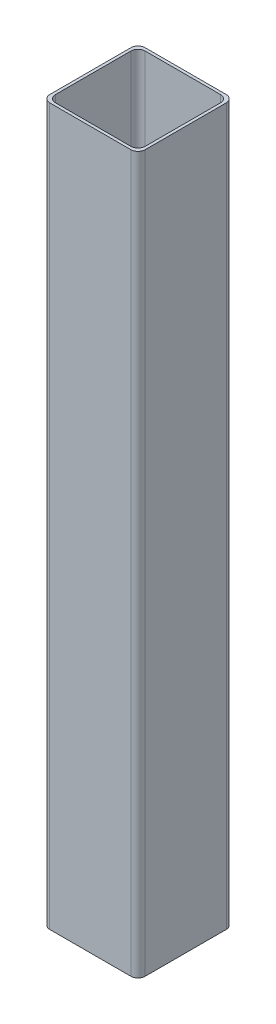
ISO-10303-21;
HEADER;
FILE_DESCRIPTION(('STEP AP214'),'2;1');
FILE_NAME('part.step','',(''),(''),'','','');
FILE_SCHEMA(('AUTOMOTIVE_DESIGN { 1 0 10303 214 1 1 1 1 }'));
ENDSEC;
DATA;
#1=APPLICATION_CONTEXT('core data for automotive mechanical design processes');
#2=APPLICATION_PROTOCOL_DEFINITION('international standard','automotive_design',2000,#1);
#3=PRODUCT_CONTEXT('',#1,'mechanical');
#4=PRODUCT('Part','Part','',(#3));
#5=PRODUCT_RELATED_PRODUCT_CATEGORY('part','',(#4));
#6=PRODUCT_DEFINITION_FORMATION('','',#4);
#7=PRODUCT_DEFINITION_CONTEXT('part definition',#1,'design');
#8=PRODUCT_DEFINITION('design','',#6,#7);
#9=PRODUCT_DEFINITION_SHAPE('','',#8);
#10=(LENGTH_UNIT() NAMED_UNIT(*) SI_UNIT(.MILLI.,.METRE.));
#11=(NAMED_UNIT(*) PLANE_ANGLE_UNIT() SI_UNIT($,.RADIAN.));
#12=(NAMED_UNIT(*) SI_UNIT($,.STERADIAN.) SOLID_ANGLE_UNIT());
#13=UNCERTAINTY_MEASURE_WITH_UNIT(LENGTH_MEASURE(1.E-05),#10,'distance_accuracy_value','');
#14=(GEOMETRIC_REPRESENTATION_CONTEXT(3) GLOBAL_UNCERTAINTY_ASSIGNED_CONTEXT((#13)) GLOBAL_UNIT_ASSIGNED_CONTEXT((#10,
#11,#12)) REPRESENTATION_CONTEXT('',''));
#15=CARTESIAN_POINT('',(0.,0.,0.));
#16=DIRECTION('',(0.,0.,1.));
#17=DIRECTION('',(1.,0.,0.));
#18=AXIS2_PLACEMENT_3D('',#15,#16,#17);
#19=CARTESIAN_POINT('',(0.,150.,0.));
#20=DIRECTION('',(0.,1.,0.));
#21=DIRECTION('',(0.,0.,1.));
#22=AXIS2_PLACEMENT_3D('',#19,#20,#21);
#23=PLANE('',#22);
#24=DIRECTION('',(-1.,0.,0.));
#25=VECTOR('',#24,1.);
#26=CARTESIAN_POINT('',(20.,150.,-20.));
#27=LINE('',#26,#25);
#28=CARTESIAN_POINT('',(17.,150.,-20.));
#29=VERTEX_POINT('',#28);
#30=CARTESIAN_POINT('',(-17.,150.,-20.));
#31=VERTEX_POINT('',#30);
#32=EDGE_CURVE('E183',#29,#31,#27,.T.);
#33=ORIENTED_EDGE('',*,*,#32,.T.);
#34=CARTESIAN_POINT('',(-17.,150.,-17.));
#35=DIRECTION('',(0.,1.,0.));
#36=DIRECTION('',(0.,0.,1.));
#37=AXIS2_PLACEMENT_3D('',#34,#35,#36);
#38=CIRCLE('',#37,3.);
#39=CARTESIAN_POINT('',(-20.,150.,-17.));
#40=VERTEX_POINT('',#39);
#41=EDGE_CURVE('E203',#31,#40,#38,.T.);
#42=ORIENTED_EDGE('',*,*,#41,.T.);
#43=DIRECTION('',(0.,0.,1.));
#44=VECTOR('',#43,1.);
#45=CARTESIAN_POINT('',(-20.,150.,20.));
#46=LINE('',#45,#44);
#47=CARTESIAN_POINT('',(-20.,150.,17.));
#48=VERTEX_POINT('',#47);
#49=EDGE_CURVE('E165',#40,#48,#46,.T.);
#50=ORIENTED_EDGE('',*,*,#49,.T.);
#51=CARTESIAN_POINT('',(-17.,150.,17.));
#52=DIRECTION('',(0.,1.,0.));
#53=DIRECTION('',(0.,0.,1.));
#54=AXIS2_PLACEMENT_3D('',#51,#52,#53);
#55=CIRCLE('',#54,3.);
#56=CARTESIAN_POINT('',(-17.,150.,20.));
#57=VERTEX_POINT('',#56);
#58=EDGE_CURVE('E199',#48,#57,#55,.T.);
#59=ORIENTED_EDGE('',*,*,#58,.T.);
#60=DIRECTION('',(1.,0.,0.));
#61=VECTOR('',#60,1.);
#62=CARTESIAN_POINT('',(20.,150.,20.));
#63=LINE('',#62,#61);
#64=CARTESIAN_POINT('',(17.,150.,20.));
#65=VERTEX_POINT('',#64);
#66=EDGE_CURVE('E275',#57,#65,#63,.T.);
#67=ORIENTED_EDGE('',*,*,#66,.T.);
#68=CARTESIAN_POINT('',(17.,150.,17.));
#69=DIRECTION('',(0.,1.,0.));
#70=DIRECTION('',(0.,0.,1.));
#71=AXIS2_PLACEMENT_3D('',#68,#69,#70);
#72=CIRCLE('',#71,3.);
#73=CARTESIAN_POINT('',(20.,150.,17.));
#74=VERTEX_POINT('',#73);
#75=EDGE_CURVE('E197',#65,#74,#72,.T.);
#76=ORIENTED_EDGE('',*,*,#75,.T.);
#77=DIRECTION('',(0.,0.,-1.));
#78=VECTOR('',#77,1.);
#79=CARTESIAN_POINT('',(20.,150.,20.));
#80=LINE('',#79,#78);
#81=CARTESIAN_POINT('',(20.,150.,-17.));
#82=VERTEX_POINT('',#81);
#83=EDGE_CURVE('E277',#74,#82,#80,.T.);
#84=ORIENTED_EDGE('',*,*,#83,.T.);
#85=CARTESIAN_POINT('',(17.,150.,-17.));
#86=DIRECTION('',(0.,1.,0.));
#87=DIRECTION('',(0.,0.,1.));
#88=AXIS2_PLACEMENT_3D('',#85,#86,#87);
#89=CIRCLE('',#88,3.);
#90=EDGE_CURVE('E201',#82,#29,#89,.T.);
#91=ORIENTED_EDGE('',*,*,#90,.T.);
#92=EDGE_LOOP('',(#33,#42,#50,#59,#67,#76,#84,#91));
#93=FACE_BOUND('',#92,.T.);
#94=DIRECTION('',(0.,0.,-1.));
#95=VECTOR('',#94,1.);
#96=CARTESIAN_POINT('',(18.8,150.,18.8));
#97=LINE('',#96,#95);
#98=CARTESIAN_POINT('',(18.8,150.,15.8));
#99=VERTEX_POINT('',#98);
#100=CARTESIAN_POINT('',(18.8,150.,-15.8));
#101=VERTEX_POINT('',#100);
#102=EDGE_CURVE('E261',#99,#101,#97,.T.);
#103=ORIENTED_EDGE('',*,*,#102,.F.);
#104=CARTESIAN_POINT('',(15.8,150.,15.8));
#105=DIRECTION('',(0.,1.,0.));
#106=DIRECTION('',(0.,0.,1.));
#107=AXIS2_PLACEMENT_3D('',#104,#105,#106);
#108=CIRCLE('',#107,3.);
#109=CARTESIAN_POINT('',(15.8,150.,18.8));
#110=VERTEX_POINT('',#109);
#111=EDGE_CURVE('E240',#99,#110,#108,.F.);
#112=ORIENTED_EDGE('',*,*,#111,.T.);
#113=DIRECTION('',(1.,0.,0.));
#114=VECTOR('',#113,1.);
#115=CARTESIAN_POINT('',(18.8,150.,18.8));
#116=LINE('',#115,#114);
#117=CARTESIAN_POINT('',(-15.8,150.,18.8));
#118=VERTEX_POINT('',#117);
#119=EDGE_CURVE('E256',#118,#110,#116,.T.);
#120=ORIENTED_EDGE('',*,*,#119,.F.);
#121=CARTESIAN_POINT('',(-15.8,150.,15.8));
#122=DIRECTION('',(0.,1.,0.));
#123=DIRECTION('',(0.,0.,1.));
#124=AXIS2_PLACEMENT_3D('',#121,#122,#123);
#125=CIRCLE('',#124,3.);
#126=CARTESIAN_POINT('',(-18.8,150.,15.8));
#127=VERTEX_POINT('',#126);
#128=EDGE_CURVE('E244',#118,#127,#125,.F.);
#129=ORIENTED_EDGE('',*,*,#128,.T.);
#130=DIRECTION('',(0.,0.,1.));
#131=VECTOR('',#130,1.);
#132=CARTESIAN_POINT('',(-18.8,150.,18.8));
#133=LINE('',#132,#131);
#134=CARTESIAN_POINT('',(-18.8,150.,-15.8));
#135=VERTEX_POINT('',#134);
#136=EDGE_CURVE('E174',#135,#127,#133,.T.);
#137=ORIENTED_EDGE('',*,*,#136,.F.);
#138=CARTESIAN_POINT('',(-15.8,150.,-15.8));
#139=DIRECTION('',(0.,1.,0.));
#140=DIRECTION('',(0.,0.,1.));
#141=AXIS2_PLACEMENT_3D('',#138,#139,#140);
#142=CIRCLE('',#141,3.);
#143=CARTESIAN_POINT('',(-15.8,150.,-18.8));
#144=VERTEX_POINT('',#143);
#145=EDGE_CURVE('E11',#135,#144,#142,.F.);
#146=ORIENTED_EDGE('',*,*,#145,.T.);
#147=DIRECTION('',(-1.,0.,0.));
#148=VECTOR('',#147,1.);
#149=CARTESIAN_POINT('',(18.8,150.,-18.8));
#150=LINE('',#149,#148);
#151=CARTESIAN_POINT('',(15.8,150.,-18.8));
#152=VERTEX_POINT('',#151);
#153=EDGE_CURVE('E180',#152,#144,#150,.T.);
#154=ORIENTED_EDGE('',*,*,#153,.F.);
#155=CARTESIAN_POINT('',(15.8,150.,-15.8));
#156=DIRECTION('',(0.,1.,0.));
#157=DIRECTION('',(0.,0.,1.));
#158=AXIS2_PLACEMENT_3D('',#155,#156,#157);
#159=CIRCLE('',#158,3.);
#160=EDGE_CURVE('E236',#152,#101,#159,.F.);
#161=ORIENTED_EDGE('',*,*,#160,.T.);
#162=EDGE_LOOP('',(#103,#112,#120,#129,#137,#146,#154,#161));
#163=FACE_BOUND('',#162,.T.);
#164=ADVANCED_FACE('F32',(#93,#163),#23,.T.);
#165=CARTESIAN_POINT('',(0.,-150.,0.));
#166=DIRECTION('',(0.,1.,0.));
#167=DIRECTION('',(0.,0.,1.));
#168=AXIS2_PLACEMENT_3D('',#165,#166,#167);
#169=PLANE('',#168);
#170=DIRECTION('',(0.,0.,1.));
#171=VECTOR('',#170,1.);
#172=CARTESIAN_POINT('',(-20.,-150.,20.));
#173=LINE('',#172,#171);
#174=CARTESIAN_POINT('',(-20.,-150.,-17.));
#175=VERTEX_POINT('',#174);
#176=CARTESIAN_POINT('',(-20.,-150.,17.));
#177=VERTEX_POINT('',#176);
#178=EDGE_CURVE('E162',#175,#177,#173,.T.);
#179=ORIENTED_EDGE('',*,*,#178,.F.);
#180=CARTESIAN_POINT('',(-17.,-150.,-17.));
#181=DIRECTION('',(0.,1.,0.));
#182=DIRECTION('',(0.,0.,1.));
#183=AXIS2_PLACEMENT_3D('',#180,#181,#182);
#184=CIRCLE('',#183,3.);
#185=CARTESIAN_POINT('',(-17.,-150.,-20.));
#186=VERTEX_POINT('',#185);
#187=EDGE_CURVE('E145',#175,#186,#184,.F.);
#188=ORIENTED_EDGE('',*,*,#187,.T.);
#189=DIRECTION('',(-1.,0.,0.));
#190=VECTOR('',#189,1.);
#191=CARTESIAN_POINT('',(20.,-150.,-20.));
#192=LINE('',#191,#190);
#193=CARTESIAN_POINT('',(17.,-150.,-20.));
#194=VERTEX_POINT('',#193);
#195=EDGE_CURVE('E188',#194,#186,#192,.T.);
#196=ORIENTED_EDGE('',*,*,#195,.F.);
#197=CARTESIAN_POINT('',(17.,-150.,-17.));
#198=DIRECTION('',(0.,1.,0.));
#199=DIRECTION('',(0.,0.,1.));
#200=AXIS2_PLACEMENT_3D('',#197,#198,#199);
#201=CIRCLE('',#200,3.);
#202=CARTESIAN_POINT('',(20.,-150.,-17.));
#203=VERTEX_POINT('',#202);
#204=EDGE_CURVE('E156',#194,#203,#201,.F.);
#205=ORIENTED_EDGE('',*,*,#204,.T.);
#206=DIRECTION('',(0.,0.,-1.));
#207=VECTOR('',#206,1.);
#208=CARTESIAN_POINT('',(20.,-150.,20.));
#209=LINE('',#208,#207);
#210=CARTESIAN_POINT('',(20.,-150.,17.));
#211=VERTEX_POINT('',#210);
#212=EDGE_CURVE('E177',#211,#203,#209,.T.);
#213=ORIENTED_EDGE('',*,*,#212,.F.);
#214=CARTESIAN_POINT('',(17.,-150.,17.));
#215=DIRECTION('',(0.,1.,0.));
#216=DIRECTION('',(0.,0.,1.));
#217=AXIS2_PLACEMENT_3D('',#214,#215,#216);
#218=CIRCLE('',#217,3.);
#219=CARTESIAN_POINT('',(17.,-150.,20.));
#220=VERTEX_POINT('',#219);
#221=EDGE_CURVE('E166',#211,#220,#218,.F.);
#222=ORIENTED_EDGE('',*,*,#221,.T.);
#223=DIRECTION('',(1.,0.,0.));
#224=VECTOR('',#223,1.);
#225=CARTESIAN_POINT('',(20.,-150.,20.));
#226=LINE('',#225,#224);
#227=CARTESIAN_POINT('',(-17.,-150.,20.));
#228=VERTEX_POINT('',#227);
#229=EDGE_CURVE('E173',#228,#220,#226,.T.);
#230=ORIENTED_EDGE('',*,*,#229,.F.);
#231=CARTESIAN_POINT('',(-17.,-150.,17.));
#232=DIRECTION('',(0.,1.,0.));
#233=DIRECTION('',(0.,0.,1.));
#234=AXIS2_PLACEMENT_3D('',#231,#232,#233);
#235=CIRCLE('',#234,3.);
#236=EDGE_CURVE('E172',#228,#177,#235,.F.);
#237=ORIENTED_EDGE('',*,*,#236,.T.);
#238=EDGE_LOOP('',(#179,#188,#196,#205,#213,#222,#230,#237));
#239=FACE_BOUND('',#238,.T.);
#240=DIRECTION('',(0.,0.,1.));
#241=VECTOR('',#240,1.);
#242=CARTESIAN_POINT('',(-18.8,-150.,18.8));
#243=LINE('',#242,#241);
#244=CARTESIAN_POINT('',(-18.8,-150.,-15.8));
#245=VERTEX_POINT('',#244);
#246=CARTESIAN_POINT('',(-18.8,-150.,15.8));
#247=VERTEX_POINT('',#246);
#248=EDGE_CURVE('E248',#245,#247,#243,.T.);
#249=ORIENTED_EDGE('',*,*,#248,.T.);
#250=CARTESIAN_POINT('',(-15.8,-150.,15.8));
#251=DIRECTION('',(0.,1.,0.));
#252=DIRECTION('',(0.,0.,1.));
#253=AXIS2_PLACEMENT_3D('',#250,#251,#252);
#254=CIRCLE('',#253,3.);
#255=CARTESIAN_POINT('',(-15.8,-150.,18.8));
#256=VERTEX_POINT('',#255);
#257=EDGE_CURVE('E242',#247,#256,#254,.T.);
#258=ORIENTED_EDGE('',*,*,#257,.T.);
#259=DIRECTION('',(1.,0.,0.));
#260=VECTOR('',#259,1.);
#261=CARTESIAN_POINT('',(18.8,-150.,18.8));
#262=LINE('',#261,#260);
#263=CARTESIAN_POINT('',(15.8,-150.,18.8));
#264=VERTEX_POINT('',#263);
#265=EDGE_CURVE('E267',#256,#264,#262,.T.);
#266=ORIENTED_EDGE('',*,*,#265,.T.);
#267=CARTESIAN_POINT('',(15.8,-150.,15.8));
#268=DIRECTION('',(0.,1.,0.));
#269=DIRECTION('',(0.,0.,1.));
#270=AXIS2_PLACEMENT_3D('',#267,#268,#269);
#271=CIRCLE('',#270,3.);
#272=CARTESIAN_POINT('',(18.8,-150.,15.8));
#273=VERTEX_POINT('',#272);
#274=EDGE_CURVE('E238',#264,#273,#271,.T.);
#275=ORIENTED_EDGE('',*,*,#274,.T.);
#276=DIRECTION('',(0.,0.,-1.));
#277=VECTOR('',#276,1.);
#278=CARTESIAN_POINT('',(18.8,-150.,18.8));
#279=LINE('',#278,#277);
#280=CARTESIAN_POINT('',(18.8,-150.,-15.8));
#281=VERTEX_POINT('',#280);
#282=EDGE_CURVE('E270',#273,#281,#279,.T.);
#283=ORIENTED_EDGE('',*,*,#282,.T.);
#284=CARTESIAN_POINT('',(15.8,-150.,-15.8));
#285=DIRECTION('',(0.,1.,0.));
#286=DIRECTION('',(0.,0.,1.));
#287=AXIS2_PLACEMENT_3D('',#284,#285,#286);
#288=CIRCLE('',#287,3.);
#289=CARTESIAN_POINT('',(15.8,-150.,-18.8));
#290=VERTEX_POINT('',#289);
#291=EDGE_CURVE('E234',#281,#290,#288,.T.);
#292=ORIENTED_EDGE('',*,*,#291,.T.);
#293=DIRECTION('',(-1.,0.,0.));
#294=VECTOR('',#293,1.);
#295=CARTESIAN_POINT('',(18.8,-150.,-18.8));
#296=LINE('',#295,#294);
#297=CARTESIAN_POINT('',(-15.8,-150.,-18.8));
#298=VERTEX_POINT('',#297);
#299=EDGE_CURVE('E249',#290,#298,#296,.T.);
#300=ORIENTED_EDGE('',*,*,#299,.T.);
#301=CARTESIAN_POINT('',(-15.8,-150.,-15.8));
#302=DIRECTION('',(0.,1.,0.));
#303=DIRECTION('',(0.,0.,1.));
#304=AXIS2_PLACEMENT_3D('',#301,#302,#303);
#305=CIRCLE('',#304,3.);
#306=EDGE_CURVE('E40',#298,#245,#305,.T.);
#307=ORIENTED_EDGE('',*,*,#306,.T.);
#308=EDGE_LOOP('',(#249,#258,#266,#275,#283,#292,#300,#307));
#309=FACE_BOUND('',#308,.T.);
#310=ADVANCED_FACE('F169',(#239,#309),#169,.F.);
#311=CARTESIAN_POINT('',(-20.,150.,20.));
#312=DIRECTION('',(1.,0.,0.));
#313=DIRECTION('',(0.,0.,-1.));
#314=AXIS2_PLACEMENT_3D('',#311,#312,#313);
#315=PLANE('',#314);
#316=ORIENTED_EDGE('',*,*,#49,.F.);
#317=DIRECTION('',(0.,-1.,0.));
#318=VECTOR('',#317,1.);
#319=CARTESIAN_POINT('',(-20.,150.,-17.));
#320=LINE('',#319,#318);
#321=EDGE_CURVE('E149',#40,#175,#320,.T.);
#322=ORIENTED_EDGE('',*,*,#321,.T.);
#323=ORIENTED_EDGE('',*,*,#178,.T.);
#324=DIRECTION('',(0.,-1.,0.));
#325=VECTOR('',#324,1.);
#326=CARTESIAN_POINT('',(-20.,150.,17.));
#327=LINE('',#326,#325);
#328=EDGE_CURVE('E167',#177,#48,#327,.F.);
#329=ORIENTED_EDGE('',*,*,#328,.T.);
#330=EDGE_LOOP('',(#316,#322,#323,#329));
#331=FACE_BOUND('',#330,.T.);
#332=ADVANCED_FACE('F161',(#331),#315,.F.);
#333=CARTESIAN_POINT('',(20.,150.,20.));
#334=DIRECTION('',(0.,0.,-1.));
#335=DIRECTION('',(-1.,0.,0.));
#336=AXIS2_PLACEMENT_3D('',#333,#334,#335);
#337=PLANE('',#336);
#338=ORIENTED_EDGE('',*,*,#66,.F.);
#339=DIRECTION('',(0.,-1.,0.));
#340=VECTOR('',#339,1.);
#341=CARTESIAN_POINT('',(-17.,150.,20.));
#342=LINE('',#341,#340);
#343=EDGE_CURVE('E231',#57,#228,#342,.T.);
#344=ORIENTED_EDGE('',*,*,#343,.T.);
#345=ORIENTED_EDGE('',*,*,#229,.T.);
#346=DIRECTION('',(0.,-1.,0.));
#347=VECTOR('',#346,1.);
#348=CARTESIAN_POINT('',(17.,150.,20.));
#349=LINE('',#348,#347);
#350=EDGE_CURVE('E229',#220,#65,#349,.F.);
#351=ORIENTED_EDGE('',*,*,#350,.T.);
#352=EDGE_LOOP('',(#338,#344,#345,#351));
#353=FACE_BOUND('',#352,.T.);
#354=ADVANCED_FACE('F299',(#353),#337,.F.);
#355=CARTESIAN_POINT('',(20.,150.,20.));
#356=DIRECTION('',(-1.,0.,0.));
#357=DIRECTION('',(0.,0.,1.));
#358=AXIS2_PLACEMENT_3D('',#355,#356,#357);
#359=PLANE('',#358);
#360=ORIENTED_EDGE('',*,*,#212,.T.);
#361=DIRECTION('',(0.,-1.,0.));
#362=VECTOR('',#361,1.);
#363=CARTESIAN_POINT('',(20.,150.,-17.));
#364=LINE('',#363,#362);
#365=EDGE_CURVE('E208',#203,#82,#364,.F.);
#366=ORIENTED_EDGE('',*,*,#365,.T.);
#367=ORIENTED_EDGE('',*,*,#83,.F.);
#368=DIRECTION('',(0.,-1.,0.));
#369=VECTOR('',#368,1.);
#370=CARTESIAN_POINT('',(20.,150.,17.));
#371=LINE('',#370,#369);
#372=EDGE_CURVE('E205',#74,#211,#371,.T.);
#373=ORIENTED_EDGE('',*,*,#372,.T.);
#374=EDGE_LOOP('',(#360,#366,#367,#373));
#375=FACE_BOUND('',#374,.T.);
#376=ADVANCED_FACE('F292',(#375),#359,.F.);
#377=CARTESIAN_POINT('',(20.,150.,-20.));
#378=DIRECTION('',(0.,0.,1.));
#379=DIRECTION('',(1.,0.,0.));
#380=AXIS2_PLACEMENT_3D('',#377,#378,#379);
#381=PLANE('',#380);
#382=ORIENTED_EDGE('',*,*,#195,.T.);
#383=DIRECTION('',(0.,-1.,0.));
#384=VECTOR('',#383,1.);
#385=CARTESIAN_POINT('',(-17.,150.,-20.));
#386=LINE('',#385,#384);
#387=EDGE_CURVE('E150',#186,#31,#386,.F.);
#388=ORIENTED_EDGE('',*,*,#387,.T.);
#389=ORIENTED_EDGE('',*,*,#32,.F.);
#390=DIRECTION('',(0.,-1.,0.));
#391=VECTOR('',#390,1.);
#392=CARTESIAN_POINT('',(17.,150.,-20.));
#393=LINE('',#392,#391);
#394=EDGE_CURVE('E155',#29,#194,#393,.T.);
#395=ORIENTED_EDGE('',*,*,#394,.T.);
#396=EDGE_LOOP('',(#382,#388,#389,#395));
#397=FACE_BOUND('',#396,.T.);
#398=ADVANCED_FACE('F286',(#397),#381,.F.);
#399=CARTESIAN_POINT('',(18.8,150.,18.8));
#400=DIRECTION('',(0.,0.,-1.));
#401=DIRECTION('',(-1.,0.,0.));
#402=AXIS2_PLACEMENT_3D('',#399,#400,#401);
#403=PLANE('',#402);
#404=ORIENTED_EDGE('',*,*,#119,.T.);
#405=DIRECTION('',(0.,-1.,0.));
#406=VECTOR('',#405,1.);
#407=CARTESIAN_POINT('',(15.8,-150.,18.8));
#408=LINE('',#407,#406);
#409=EDGE_CURVE('E221',#110,#264,#408,.T.);
#410=ORIENTED_EDGE('',*,*,#409,.T.);
#411=ORIENTED_EDGE('',*,*,#265,.F.);
#412=DIRECTION('',(0.,-1.,0.));
#413=VECTOR('',#412,1.);
#414=CARTESIAN_POINT('',(-15.8,150.,18.8));
#415=LINE('',#414,#413);
#416=EDGE_CURVE('E219',#256,#118,#415,.F.);
#417=ORIENTED_EDGE('',*,*,#416,.T.);
#418=EDGE_LOOP('',(#404,#410,#411,#417));
#419=FACE_BOUND('',#418,.T.);
#420=ADVANCED_FACE('F318',(#419),#403,.T.);
#421=CARTESIAN_POINT('',(18.8,150.,18.8));
#422=DIRECTION('',(-1.,0.,0.));
#423=DIRECTION('',(0.,0.,1.));
#424=AXIS2_PLACEMENT_3D('',#421,#422,#423);
#425=PLANE('',#424);
#426=ORIENTED_EDGE('',*,*,#102,.T.);
#427=DIRECTION('',(0.,-1.,0.));
#428=VECTOR('',#427,1.);
#429=CARTESIAN_POINT('',(18.8,-150.,-15.8));
#430=LINE('',#429,#428);
#431=EDGE_CURVE('E212',#101,#281,#430,.T.);
#432=ORIENTED_EDGE('',*,*,#431,.T.);
#433=ORIENTED_EDGE('',*,*,#282,.F.);
#434=DIRECTION('',(0.,-1.,0.));
#435=VECTOR('',#434,1.);
#436=CARTESIAN_POINT('',(18.8,150.,15.8));
#437=LINE('',#436,#435);
#438=EDGE_CURVE('E210',#273,#99,#437,.F.);
#439=ORIENTED_EDGE('',*,*,#438,.T.);
#440=EDGE_LOOP('',(#426,#432,#433,#439));
#441=FACE_BOUND('',#440,.T.);
#442=ADVANCED_FACE('F357',(#441),#425,.T.);
#443=CARTESIAN_POINT('',(18.8,150.,-18.8));
#444=DIRECTION('',(0.,0.,1.));
#445=DIRECTION('',(1.,0.,0.));
#446=AXIS2_PLACEMENT_3D('',#443,#444,#445);
#447=PLANE('',#446);
#448=ORIENTED_EDGE('',*,*,#299,.F.);
#449=DIRECTION('',(0.,-1.,0.));
#450=VECTOR('',#449,1.);
#451=CARTESIAN_POINT('',(15.8,150.,-18.8));
#452=LINE('',#451,#450);
#453=EDGE_CURVE('E52',#290,#152,#452,.F.);
#454=ORIENTED_EDGE('',*,*,#453,.T.);
#455=ORIENTED_EDGE('',*,*,#153,.T.);
#456=DIRECTION('',(0.,-1.,0.));
#457=VECTOR('',#456,1.);
#458=CARTESIAN_POINT('',(-15.8,-150.,-18.8));
#459=LINE('',#458,#457);
#460=EDGE_CURVE('E215',#144,#298,#459,.T.);
#461=ORIENTED_EDGE('',*,*,#460,.T.);
#462=EDGE_LOOP('',(#448,#454,#455,#461));
#463=FACE_BOUND('',#462,.T.);
#464=ADVANCED_FACE('F259',(#463),#447,.T.);
#465=CARTESIAN_POINT('',(-18.8,150.,18.8));
#466=DIRECTION('',(1.,0.,0.));
#467=DIRECTION('',(0.,0.,-1.));
#468=AXIS2_PLACEMENT_3D('',#465,#466,#467);
#469=PLANE('',#468);
#470=ORIENTED_EDGE('',*,*,#136,.T.);
#471=DIRECTION('',(0.,-1.,0.));
#472=VECTOR('',#471,1.);
#473=CARTESIAN_POINT('',(-18.8,-150.,15.8));
#474=LINE('',#473,#472);
#475=EDGE_CURVE('E226',#127,#247,#474,.T.);
#476=ORIENTED_EDGE('',*,*,#475,.T.);
#477=ORIENTED_EDGE('',*,*,#248,.F.);
#478=DIRECTION('',(0.,-1.,0.));
#479=VECTOR('',#478,1.);
#480=CARTESIAN_POINT('',(-18.8,150.,-15.8));
#481=LINE('',#480,#479);
#482=EDGE_CURVE('E224',#245,#135,#481,.F.);
#483=ORIENTED_EDGE('',*,*,#482,.T.);
#484=EDGE_LOOP('',(#470,#476,#477,#483));
#485=FACE_BOUND('',#484,.T.);
#486=ADVANCED_FACE('F254',(#485),#469,.T.);
#487=CARTESIAN_POINT('',(-17.,150.,-17.));
#488=DIRECTION('',(0.,-1.,0.));
#489=DIRECTION('',(0.,0.,-1.));
#490=AXIS2_PLACEMENT_3D('',#487,#488,#489);
#491=CYLINDRICAL_SURFACE('',#490,3.);
#492=ORIENTED_EDGE('',*,*,#41,.F.);
#493=ORIENTED_EDGE('',*,*,#387,.F.);
#494=ORIENTED_EDGE('',*,*,#187,.F.);
#495=ORIENTED_EDGE('',*,*,#321,.F.);
#496=EDGE_LOOP('',(#492,#493,#494,#495));
#497=FACE_BOUND('',#496,.T.);
#498=ADVANCED_FACE('F148',(#497),#491,.T.);
#499=CARTESIAN_POINT('',(17.,150.,-17.));
#500=DIRECTION('',(0.,-1.,0.));
#501=DIRECTION('',(0.,0.,-1.));
#502=AXIS2_PLACEMENT_3D('',#499,#500,#501);
#503=CYLINDRICAL_SURFACE('',#502,3.);
#504=ORIENTED_EDGE('',*,*,#90,.F.);
#505=ORIENTED_EDGE('',*,*,#365,.F.);
#506=ORIENTED_EDGE('',*,*,#204,.F.);
#507=ORIENTED_EDGE('',*,*,#394,.F.);
#508=EDGE_LOOP('',(#504,#505,#506,#507));
#509=FACE_BOUND('',#508,.T.);
#510=ADVANCED_FACE('F288',(#509),#503,.T.);
#511=CARTESIAN_POINT('',(15.8,150.,-15.8));
#512=DIRECTION('',(0.,1.,0.));
#513=DIRECTION('',(0.,0.,1.));
#514=AXIS2_PLACEMENT_3D('',#511,#512,#513);
#515=CYLINDRICAL_SURFACE('',#514,3.);
#516=ORIENTED_EDGE('',*,*,#160,.F.);
#517=ORIENTED_EDGE('',*,*,#453,.F.);
#518=ORIENTED_EDGE('',*,*,#291,.F.);
#519=ORIENTED_EDGE('',*,*,#431,.F.);
#520=EDGE_LOOP('',(#516,#517,#518,#519));
#521=FACE_BOUND('',#520,.T.);
#522=ADVANCED_FACE('F333',(#521),#515,.F.);
#523=CARTESIAN_POINT('',(15.8,150.,15.8));
#524=DIRECTION('',(0.,1.,0.));
#525=DIRECTION('',(0.,0.,1.));
#526=AXIS2_PLACEMENT_3D('',#523,#524,#525);
#527=CYLINDRICAL_SURFACE('',#526,3.);
#528=ORIENTED_EDGE('',*,*,#111,.F.);
#529=ORIENTED_EDGE('',*,*,#438,.F.);
#530=ORIENTED_EDGE('',*,*,#274,.F.);
#531=ORIENTED_EDGE('',*,*,#409,.F.);
#532=EDGE_LOOP('',(#528,#529,#530,#531));
#533=FACE_BOUND('',#532,.T.);
#534=ADVANCED_FACE('F336',(#533),#527,.F.);
#535=CARTESIAN_POINT('',(-15.8,150.,15.8));
#536=DIRECTION('',(0.,1.,0.));
#537=DIRECTION('',(0.,0.,1.));
#538=AXIS2_PLACEMENT_3D('',#535,#536,#537);
#539=CYLINDRICAL_SURFACE('',#538,3.);
#540=ORIENTED_EDGE('',*,*,#128,.F.);
#541=ORIENTED_EDGE('',*,*,#416,.F.);
#542=ORIENTED_EDGE('',*,*,#257,.F.);
#543=ORIENTED_EDGE('',*,*,#475,.F.);
#544=EDGE_LOOP('',(#540,#541,#542,#543));
#545=FACE_BOUND('',#544,.T.);
#546=ADVANCED_FACE('F309',(#545),#539,.F.);
#547=CARTESIAN_POINT('',(-15.8,150.,-15.8));
#548=DIRECTION('',(0.,1.,0.));
#549=DIRECTION('',(0.,0.,1.));
#550=AXIS2_PLACEMENT_3D('',#547,#548,#549);
#551=CYLINDRICAL_SURFACE('',#550,3.);
#552=ORIENTED_EDGE('',*,*,#145,.F.);
#553=ORIENTED_EDGE('',*,*,#482,.F.);
#554=ORIENTED_EDGE('',*,*,#306,.F.);
#555=ORIENTED_EDGE('',*,*,#460,.F.);
#556=EDGE_LOOP('',(#552,#553,#554,#555));
#557=FACE_BOUND('',#556,.T.);
#558=ADVANCED_FACE('F258',(#557),#551,.F.);
#559=CARTESIAN_POINT('',(-17.,150.,17.));
#560=DIRECTION('',(0.,-1.,0.));
#561=DIRECTION('',(0.,0.,-1.));
#562=AXIS2_PLACEMENT_3D('',#559,#560,#561);
#563=CYLINDRICAL_SURFACE('',#562,3.);
#564=ORIENTED_EDGE('',*,*,#58,.F.);
#565=ORIENTED_EDGE('',*,*,#328,.F.);
#566=ORIENTED_EDGE('',*,*,#236,.F.);
#567=ORIENTED_EDGE('',*,*,#343,.F.);
#568=EDGE_LOOP('',(#564,#565,#566,#567));
#569=FACE_BOUND('',#568,.T.);
#570=ADVANCED_FACE('F303',(#569),#563,.T.);
#571=CARTESIAN_POINT('',(17.,150.,17.));
#572=DIRECTION('',(0.,-1.,0.));
#573=DIRECTION('',(0.,0.,-1.));
#574=AXIS2_PLACEMENT_3D('',#571,#572,#573);
#575=CYLINDRICAL_SURFACE('',#574,3.);
#576=ORIENTED_EDGE('',*,*,#75,.F.);
#577=ORIENTED_EDGE('',*,*,#350,.F.);
#578=ORIENTED_EDGE('',*,*,#221,.F.);
#579=ORIENTED_EDGE('',*,*,#372,.F.);
#580=EDGE_LOOP('',(#576,#577,#578,#579));
#581=FACE_BOUND('',#580,.T.);
#582=ADVANCED_FACE('F34',(#581),#575,.T.);
#583=CLOSED_SHELL('',(#164,#310,#332,#354,#376,#398,#420,#442,#464,#486,#498,#510,#522,#534,
#546,#558,#570,#582));
#584=MANIFOLD_SOLID_BREP('B2',#583);
#585=ADVANCED_BREP_SHAPE_REPRESENTATION('',(#18,#584),#14);
#586=SHAPE_DEFINITION_REPRESENTATION(#9,#585);
ENDSEC;
END-ISO-10303-21;
